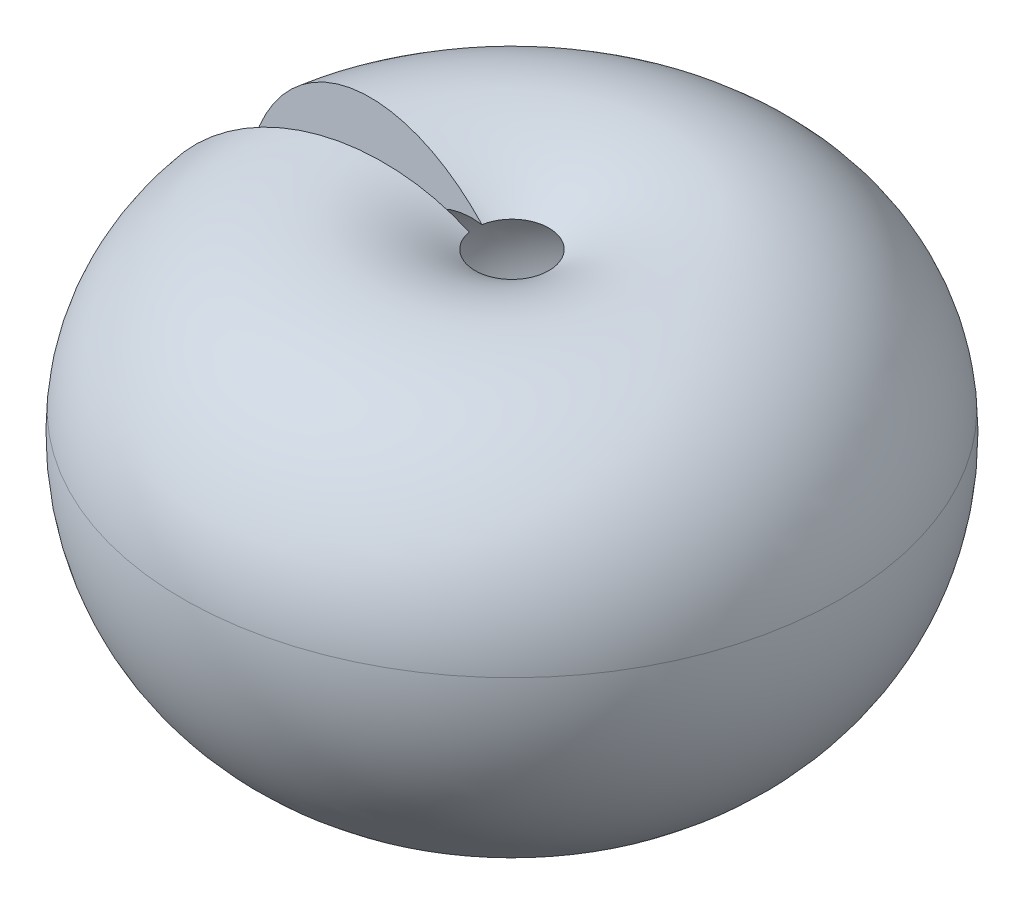
ISO-10303-21;
HEADER;
FILE_DESCRIPTION(('STEP AP214'),'2;1');
FILE_NAME('part.step','',(''),(''),'','','');
FILE_SCHEMA(('AUTOMOTIVE_DESIGN { 1 0 10303 214 1 1 1 1 }'));
ENDSEC;
DATA;
#1=APPLICATION_CONTEXT('core data for automotive mechanical design processes');
#2=APPLICATION_PROTOCOL_DEFINITION('international standard','automotive_design',2000,#1);
#3=PRODUCT_CONTEXT('',#1,'mechanical');
#4=PRODUCT('Part','Part','',(#3));
#5=PRODUCT_RELATED_PRODUCT_CATEGORY('part','',(#4));
#6=PRODUCT_DEFINITION_FORMATION('','',#4);
#7=PRODUCT_DEFINITION_CONTEXT('part definition',#1,'design');
#8=PRODUCT_DEFINITION('design','',#6,#7);
#9=PRODUCT_DEFINITION_SHAPE('','',#8);
#10=(LENGTH_UNIT() NAMED_UNIT(*) SI_UNIT(.MILLI.,.METRE.));
#11=(NAMED_UNIT(*) PLANE_ANGLE_UNIT() SI_UNIT($,.RADIAN.));
#12=(NAMED_UNIT(*) SI_UNIT($,.STERADIAN.) SOLID_ANGLE_UNIT());
#13=UNCERTAINTY_MEASURE_WITH_UNIT(LENGTH_MEASURE(1.E-05),#10,'distance_accuracy_value','');
#14=(GEOMETRIC_REPRESENTATION_CONTEXT(3) GLOBAL_UNCERTAINTY_ASSIGNED_CONTEXT((#13)) GLOBAL_UNIT_ASSIGNED_CONTEXT((#10,
#11,#12)) REPRESENTATION_CONTEXT('',''));
#15=CARTESIAN_POINT('',(0.,0.,0.));
#16=DIRECTION('',(0.,0.,1.));
#17=DIRECTION('',(1.,0.,0.));
#18=AXIS2_PLACEMENT_3D('',#15,#16,#17);
#19=CARTESIAN_POINT('',(0.,-463.000000000001,0.));
#20=DIRECTION('',(0.,1.,0.));
#21=DIRECTION('',(-1.,0.,0.));
#22=AXIS2_PLACEMENT_3D('',#19,#20,#21);
#23=DEGENERATE_TOROIDAL_SURFACE('',#22,150.,561.000000000002,.T.);
#24=CARTESIAN_POINT('',(0.,-900.788717311779,0.));
#25=DIRECTION('',(0.,1.,0.));
#26=DIRECTION('',(-1.,0.,0.));
#27=AXIS2_PLACEMENT_3D('',#24,#25,#26);
#28=CIRCLE('',#27,500.801994000189);
#29=CARTESIAN_POINT('',(-493.193686415359,-900.788717311779,86.9633536300946));
#30=VERTEX_POINT('',#29);
#31=CARTESIAN_POINT('',(-493.19368641536,-900.788717311779,-86.9633536300946));
#32=VERTEX_POINT('',#31);
#33=EDGE_CURVE('E11',#30,#32,#28,.T.);
#34=ORIENTED_EDGE('',*,*,#33,.F.);
#35=CARTESIAN_POINT('',(-147.721162951831,-463.000000000001,26.0472266500386));
#36=DIRECTION('',(-0.173648177666924,0.,-0.984807753012209));
#37=DIRECTION('',(-0.984807753012209,0.,0.173648177666924));
#38=AXIS2_PLACEMENT_3D('',#35,#36,#37);
#39=CIRCLE('',#38,561.000000000002);
#40=CARTESIAN_POINT('',(-181.611405517366,96.943516527971,32.0229907970967));
#41=VERTEX_POINT('',#40);
#42=EDGE_CURVE('E108',#30,#41,#39,.T.);
#43=ORIENTED_EDGE('',*,*,#42,.T.);
#44=CARTESIAN_POINT('',(0.,96.943516527971,0.));
#45=DIRECTION('',(0.,1.,0.));
#46=DIRECTION('',(-1.,0.,0.));
#47=AXIS2_PLACEMENT_3D('',#44,#45,#46);
#48=CIRCLE('',#47,184.413054184307);
#49=CARTESIAN_POINT('',(-181.611405517366,96.943516527971,-32.0229907970967));
#50=VERTEX_POINT('',#49);
#51=EDGE_CURVE('E50',#41,#50,#48,.T.);
#52=ORIENTED_EDGE('',*,*,#51,.T.);
#53=CARTESIAN_POINT('',(-147.721162951831,-463.000000000001,-26.0472266500386));
#54=DIRECTION('',(0.173648177666924,0.,-0.984807753012209));
#55=DIRECTION('',(-0.984807753012209,0.,-0.173648177666924));
#56=AXIS2_PLACEMENT_3D('',#53,#54,#55);
#57=CIRCLE('',#56,561.000000000002);
#58=EDGE_CURVE('E91',#32,#50,#57,.T.);
#59=ORIENTED_EDGE('',*,*,#58,.F.);
#60=EDGE_LOOP('',(#34,#43,#52,#59));
#61=FACE_BOUND('',#60,.T.);
#62=ADVANCED_FACE('F35',(#61),#23,.F.);
#63=CARTESIAN_POINT('',(410.723435851275,-664.203865455733,0.));
#64=DIRECTION('',(0.,0.,-1.));
#65=DIRECTION('',(-1.,0.,0.));
#66=AXIS2_PLACEMENT_3D('',#63,#64,#65);
#67=CIRCLE('',#66,941.727668380643);
#68=TRIMMED_CURVE('',#67,(PARAMETER_VALUE(-1.11949357110232)),
(PARAMETER_VALUE(1.11949357110232)),.T.,.PARAMETER.);
#69=CARTESIAN_POINT('',(0.,-664.203865455733,0.));
#70=DIRECTION('',(0.,1.,0.));
#71=AXIS1_PLACEMENT('',#69,#70);
#72=SURFACE_OF_REVOLUTION('',#68,#71);
#73=CARTESIAN_POINT('',(404.483623970148,-664.203865455733,71.3213761606717));
#74=DIRECTION('',(0.173648177666924,0.,-0.984807753012209));
#75=DIRECTION('',(-0.984807753012209,0.,-0.173648177666924));
#76=AXIS2_PLACEMENT_3D('',#73,#74,#75);
#77=CIRCLE('',#76,941.727668380643);
#78=CARTESIAN_POINT('',(0.,-1511.64546263879,0.));
#79=VERTEX_POINT('',#78);
#80=EDGE_CURVE('E85',#79,#32,#77,.T.);
#81=ORIENTED_EDGE('',*,*,#80,.F.);
#82=CARTESIAN_POINT('',(404.483623970148,-664.203865455733,-71.3213761606717));
#83=DIRECTION('',(-0.173648177666924,0.,-0.984807753012209));
#84=DIRECTION('',(-0.984807753012209,0.,0.173648177666924));
#85=AXIS2_PLACEMENT_3D('',#82,#83,#84);
#86=CIRCLE('',#85,941.727668380643);
#87=EDGE_CURVE('E87',#79,#30,#86,.T.);
#88=ORIENTED_EDGE('',*,*,#87,.T.);
#89=ORIENTED_EDGE('',*,*,#33,.T.);
#90=EDGE_LOOP('',(#81,#88,#89));
#91=FACE_BOUND('',#90,.T.);
#92=ADVANCED_FACE('F37',(#91),#72,.F.);
#93=CARTESIAN_POINT('',(-533.879397411605,856.898422159871,0.));
#94=DIRECTION('',(0.,0.,-1.));
#95=DIRECTION('',(-1.,0.,0.));
#96=AXIS2_PLACEMENT_3D('',#93,#94,#95);
#97=CIRCLE('',#96,2868.86871774885);
#98=TRIMMED_CURVE('',#97,(PARAMETER_VALUE(-1.75798157224083)),
(PARAMETER_VALUE(1.75798157224083)),.T.,.PARAMETER.);
#99=CARTESIAN_POINT('',(0.,856.898422159871,0.));
#100=DIRECTION('',(0.,1.,0.));
#101=AXIS1_PLACEMENT('',#99,#100);
#102=SURFACE_OF_REVOLUTION('',#98,#101);
#103=CARTESIAN_POINT('',(0.,-1990.5034636244,0.));
#104=DIRECTION('',(0.,1.,0.));
#105=DIRECTION('',(-1.,0.,0.));
#106=AXIS2_PLACEMENT_3D('',#103,#104,#105);
#107=CIRCLE('',#106,183.579211128337);
#108=CARTESIAN_POINT('',(-180.790230411052,-1990.5034636244,31.8781954699673));
#109=VERTEX_POINT('',#108);
#110=CARTESIAN_POINT('',(-180.790230411052,-1990.5034636244,-31.8781954699673));
#111=VERTEX_POINT('',#110);
#112=EDGE_CURVE('E43',#109,#111,#107,.T.);
#113=ORIENTED_EDGE('',*,*,#112,.F.);
#114=CARTESIAN_POINT('',(-525.768569744435,856.898422159871,92.7071844544408));
#115=DIRECTION('',(-0.173648177666924,0.,-0.984807753012209));
#116=DIRECTION('',(-0.984807753012209,0.,0.173648177666924));
#117=AXIS2_PLACEMENT_3D('',#114,#115,#116);
#118=CIRCLE('',#117,2868.86871774885);
#119=CARTESIAN_POINT('',(0.,-1961.85671241592,0.));
#120=VERTEX_POINT('',#119);
#121=EDGE_CURVE('E112',#120,#109,#118,.T.);
#122=ORIENTED_EDGE('',*,*,#121,.F.);
#123=CARTESIAN_POINT('',(-525.768569744435,856.898422159871,-92.7071844544408));
#124=DIRECTION('',(0.173648177666924,0.,-0.984807753012209));
#125=DIRECTION('',(-0.984807753012209,0.,-0.173648177666924));
#126=AXIS2_PLACEMENT_3D('',#123,#124,#125);
#127=CIRCLE('',#126,2868.86871774885);
#128=EDGE_CURVE('E98',#120,#111,#127,.T.);
#129=ORIENTED_EDGE('',*,*,#128,.T.);
#130=EDGE_LOOP('',(#113,#122,#129));
#131=FACE_BOUND('',#130,.T.);
#132=ADVANCED_FACE('F123',(#131),#102,.T.);
#133=CARTESIAN_POINT('',(0.,-697.488709125593,0.));
#134=DIRECTION('',(0.,1.,0.));
#135=DIRECTION('',(-1.,0.,0.));
#136=AXIS2_PLACEMENT_3D('',#133,#134,#135);
#137=DEGENERATE_TOROIDAL_SURFACE('',#136,342.651701607938,1302.76291495383,.T.);
#138=CARTESIAN_POINT('',(0.,-595.047704247558,0.));
#139=DIRECTION('',(0.,1.,0.));
#140=DIRECTION('',(-1.,0.,0.));
#141=AXIS2_PLACEMENT_3D('',#138,#139,#140);
#142=CIRCLE('',#141,1641.3807161058);
#143=CARTESIAN_POINT('',(-1616.44445486572,-595.047704247558,285.022770209403));
#144=VERTEX_POINT('',#143);
#145=CARTESIAN_POINT('',(-1616.44445486572,-595.047704247558,-285.022770209403));
#146=VERTEX_POINT('',#145);
#147=EDGE_CURVE('E58',#144,#146,#142,.T.);
#148=ORIENTED_EDGE('',*,*,#147,.F.);
#149=CARTESIAN_POINT('',(-337.446052326323,-697.488709125593,59.500843558689));
#150=DIRECTION('',(-0.173648177666924,0.,-0.984807753012209));
#151=DIRECTION('',(-0.984807753012209,0.,0.173648177666924));
#152=AXIS2_PLACEMENT_3D('',#149,#150,#151);
#153=CIRCLE('',#152,1302.76291495383);
#154=EDGE_CURVE('E115',#144,#109,#153,.F.);
#155=ORIENTED_EDGE('',*,*,#154,.T.);
#156=ORIENTED_EDGE('',*,*,#112,.T.);
#157=CARTESIAN_POINT('',(-337.446052326323,-697.488709125593,-59.500843558689));
#158=DIRECTION('',(0.173648177666924,0.,-0.984807753012209));
#159=DIRECTION('',(-0.984807753012209,0.,-0.173648177666924));
#160=AXIS2_PLACEMENT_3D('',#157,#158,#159);
#161=CIRCLE('',#160,1302.76291495383);
#162=EDGE_CURVE('E101',#146,#111,#161,.F.);
#163=ORIENTED_EDGE('',*,*,#162,.F.);
#164=EDGE_LOOP('',(#148,#155,#156,#163));
#165=FACE_BOUND('',#164,.T.);
#166=ADVANCED_FACE('F120',(#165),#137,.T.);
#167=CARTESIAN_POINT('',(0.,-668.212085995409,0.));
#168=DIRECTION('',(0.,1.,0.));
#169=DIRECTION('',(-1.,0.,0.));
#170=AXIS2_PLACEMENT_3D('',#167,#168,#169);
#171=DEGENERATE_TOROIDAL_SURFACE('',#170,713.815572471541,930.446195350264,.T.);
#172=CARTESIAN_POINT('',(-702.971109990822,-668.212085995409,123.952773349955));
#173=DIRECTION('',(-0.173648177666924,0.,-0.984807753012209));
#174=DIRECTION('',(-0.984807753012209,0.,0.173648177666924));
#175=AXIS2_PLACEMENT_3D('',#172,#173,#174);
#176=CIRCLE('',#175,930.446195350264);
#177=EDGE_CURVE('E117',#41,#144,#176,.F.);
#178=ORIENTED_EDGE('',*,*,#177,.T.);
#179=ORIENTED_EDGE('',*,*,#147,.T.);
#180=CARTESIAN_POINT('',(-702.971109990822,-668.212085995409,-123.952773349955));
#181=DIRECTION('',(0.173648177666924,0.,-0.984807753012209));
#182=DIRECTION('',(-0.984807753012209,0.,-0.173648177666924));
#183=AXIS2_PLACEMENT_3D('',#180,#181,#182);
#184=CIRCLE('',#183,930.446195350264);
#185=EDGE_CURVE('E106',#50,#146,#184,.F.);
#186=ORIENTED_EDGE('',*,*,#185,.F.);
#187=ORIENTED_EDGE('',*,*,#51,.F.);
#188=EDGE_LOOP('',(#178,#179,#186,#187));
#189=FACE_BOUND('',#188,.T.);
#190=ADVANCED_FACE('F124',(#189),#171,.T.);
#191=CARTESIAN_POINT('',(0.,0.,0.));
#192=DIRECTION('',(-0.173648177666924,0.,-0.984807753012209));
#193=DIRECTION('',(-0.984807753012209,0.,0.173648177666924));
#194=AXIS2_PLACEMENT_3D('',#191,#192,#193);
#195=PLANE('',#194);
#196=ORIENTED_EDGE('',*,*,#42,.F.);
#197=ORIENTED_EDGE('',*,*,#87,.F.);
#198=DIRECTION('',(0.,-1.,0.));
#199=VECTOR('',#198,1.);
#200=CARTESIAN_POINT('',(1.65893797685472E-13,0.,0.));
#201=LINE('',#200,#199);
#202=EDGE_CURVE('E97',#79,#120,#201,.T.);
#203=ORIENTED_EDGE('',*,*,#202,.T.);
#204=ORIENTED_EDGE('',*,*,#121,.T.);
#205=ORIENTED_EDGE('',*,*,#154,.F.);
#206=ORIENTED_EDGE('',*,*,#177,.F.);
#207=EDGE_LOOP('',(#196,#197,#203,#204,#205,#206));
#208=FACE_BOUND('',#207,.T.);
#209=ADVANCED_FACE('F127',(#208),#195,.T.);
#210=CARTESIAN_POINT('',(0.,0.,0.));
#211=DIRECTION('',(0.173648177666924,0.,-0.984807753012209));
#212=DIRECTION('',(-0.984807753012209,0.,-0.173648177666924));
#213=AXIS2_PLACEMENT_3D('',#210,#211,#212);
#214=PLANE('',#213);
#215=ORIENTED_EDGE('',*,*,#58,.T.);
#216=ORIENTED_EDGE('',*,*,#185,.T.);
#217=ORIENTED_EDGE('',*,*,#162,.T.);
#218=ORIENTED_EDGE('',*,*,#128,.F.);
#219=ORIENTED_EDGE('',*,*,#202,.F.);
#220=ORIENTED_EDGE('',*,*,#80,.T.);
#221=EDGE_LOOP('',(#215,#216,#217,#218,#219,#220));
#222=FACE_BOUND('',#221,.T.);
#223=ADVANCED_FACE('F95',(#222),#214,.F.);
#224=CLOSED_SHELL('',(#62,#92,#132,#166,#190,#209,#223));
#225=MANIFOLD_SOLID_BREP('B2',#224);
#226=ADVANCED_BREP_SHAPE_REPRESENTATION('',(#18,#225),#14);
#227=SHAPE_DEFINITION_REPRESENTATION(#9,#226);
ENDSEC;
END-ISO-10303-21;
